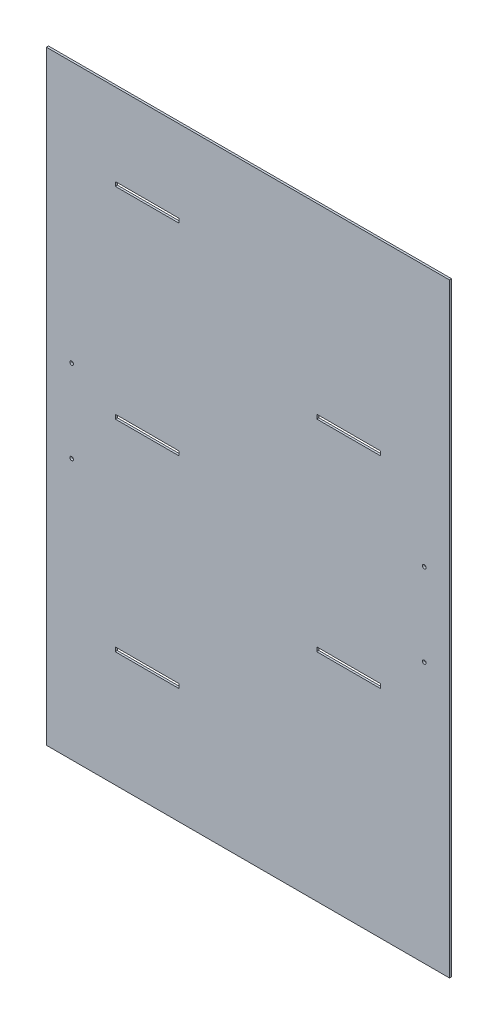
ISO-10303-21;
HEADER;
FILE_DESCRIPTION(('STEP AP214'),'2;1');
FILE_NAME('part.step','',(''),(''),'','','');
FILE_SCHEMA(('AUTOMOTIVE_DESIGN { 1 0 10303 214 1 1 1 1 }'));
ENDSEC;
DATA;
#1=APPLICATION_CONTEXT('core data for automotive mechanical design processes');
#2=APPLICATION_PROTOCOL_DEFINITION('international standard','automotive_design',2000,#1);
#3=PRODUCT_CONTEXT('',#1,'mechanical');
#4=PRODUCT('Part','Part','',(#3));
#5=PRODUCT_RELATED_PRODUCT_CATEGORY('part','',(#4));
#6=PRODUCT_DEFINITION_FORMATION('','',#4);
#7=PRODUCT_DEFINITION_CONTEXT('part definition',#1,'design');
#8=PRODUCT_DEFINITION('design','',#6,#7);
#9=PRODUCT_DEFINITION_SHAPE('','',#8);
#10=(LENGTH_UNIT() NAMED_UNIT(*) SI_UNIT(.MILLI.,.METRE.));
#11=(NAMED_UNIT(*) PLANE_ANGLE_UNIT() SI_UNIT($,.RADIAN.));
#12=(NAMED_UNIT(*) SI_UNIT($,.STERADIAN.) SOLID_ANGLE_UNIT());
#13=UNCERTAINTY_MEASURE_WITH_UNIT(LENGTH_MEASURE(1.E-05),#10,'distance_accuracy_value','');
#14=(GEOMETRIC_REPRESENTATION_CONTEXT(3) GLOBAL_UNCERTAINTY_ASSIGNED_CONTEXT((#13)) GLOBAL_UNIT_ASSIGNED_CONTEXT((#10,
#11,#12)) REPRESENTATION_CONTEXT('',''));
#15=CARTESIAN_POINT('',(0.,0.,0.));
#16=DIRECTION('',(0.,0.,1.));
#17=DIRECTION('',(1.,0.,0.));
#18=AXIS2_PLACEMENT_3D('',#15,#16,#17);
#19=CARTESIAN_POINT('',(0.,0.,1.5875));
#20=DIRECTION('',(0.,0.,-1.));
#21=DIRECTION('',(-1.,0.,0.));
#22=AXIS2_PLACEMENT_3D('',#19,#20,#21);
#23=PLANE('',#22);
#24=CARTESIAN_POINT('',(-266.7,62.5,1.5875));
#25=DIRECTION('',(0.,0.,1.));
#26=DIRECTION('',(1.,0.,0.));
#27=AXIS2_PLACEMENT_3D('',#24,#25,#26);
#28=CIRCLE('',#27,2.74999999999997);
#29=CARTESIAN_POINT('',(-263.95,62.5,1.5875));
#30=VERTEX_POINT('',#29);
#31=EDGE_CURVE('E761',#30,#30,#28,.T.);
#32=ORIENTED_EDGE('',*,*,#31,.F.);
#33=EDGE_LOOP('',(#32));
#34=FACE_BOUND('',#33,.T.);
#35=CARTESIAN_POINT('',(-266.7,-62.5,1.5875));
#36=DIRECTION('',(0.,0.,1.));
#37=DIRECTION('',(1.,0.,0.));
#38=AXIS2_PLACEMENT_3D('',#35,#36,#37);
#39=CIRCLE('',#38,2.74999999999997);
#40=CARTESIAN_POINT('',(-263.95,-62.5,1.5875));
#41=VERTEX_POINT('',#40);
#42=EDGE_CURVE('E765',#41,#41,#39,.T.);
#43=ORIENTED_EDGE('',*,*,#42,.F.);
#44=EDGE_LOOP('',(#43));
#45=FACE_BOUND('',#44,.T.);
#46=CARTESIAN_POINT('',(266.7,-62.5,1.5875));
#47=DIRECTION('',(0.,0.,1.));
#48=DIRECTION('',(1.,0.,0.));
#49=AXIS2_PLACEMENT_3D('',#46,#47,#48);
#50=CIRCLE('',#49,2.74999999999997);
#51=CARTESIAN_POINT('',(269.45,-62.5,1.5875));
#52=VERTEX_POINT('',#51);
#53=EDGE_CURVE('E783',#52,#52,#50,.T.);
#54=ORIENTED_EDGE('',*,*,#53,.F.);
#55=EDGE_LOOP('',(#54));
#56=FACE_BOUND('',#55,.T.);
#57=DIRECTION('',(0.,1.,0.));
#58=VECTOR('',#57,1.);
#59=CARTESIAN_POINT('',(-104.14,0.,1.5875));
#60=LINE('',#59,#58);
#61=CARTESIAN_POINT('',(-104.14,22.225,1.5875));
#62=VERTEX_POINT('',#61);
#63=CARTESIAN_POINT('',(-104.14,28.575,1.5875));
#64=VERTEX_POINT('',#63);
#65=EDGE_CURVE('E317',#62,#64,#60,.T.);
#66=ORIENTED_EDGE('',*,*,#65,.F.);
#67=DIRECTION('',(1.,0.,0.));
#68=VECTOR('',#67,1.);
#69=CARTESIAN_POINT('',(0.,22.225,1.5875));
#70=LINE('',#69,#68);
#71=CARTESIAN_POINT('',(-200.66,22.225,1.5875));
#72=VERTEX_POINT('',#71);
#73=EDGE_CURVE('E55',#72,#62,#70,.T.);
#74=ORIENTED_EDGE('',*,*,#73,.F.);
#75=DIRECTION('',(0.,1.,0.));
#76=VECTOR('',#75,1.);
#77=CARTESIAN_POINT('',(-200.66,0.,1.5875));
#78=LINE('',#77,#76);
#79=CARTESIAN_POINT('',(-200.66,28.575,1.5875));
#80=VERTEX_POINT('',#79);
#81=EDGE_CURVE('E308',#72,#80,#78,.T.);
#82=ORIENTED_EDGE('',*,*,#81,.T.);
#83=DIRECTION('',(1.,0.,0.));
#84=VECTOR('',#83,1.);
#85=CARTESIAN_POINT('',(0.,28.575,1.5875));
#86=LINE('',#85,#84);
#87=EDGE_CURVE('E312',#80,#64,#86,.T.);
#88=ORIENTED_EDGE('',*,*,#87,.T.);
#89=EDGE_LOOP('',(#66,#74,#82,#88));
#90=FACE_BOUND('',#89,.T.);
#91=DIRECTION('',(0.,1.,0.));
#92=VECTOR('',#91,1.);
#93=CARTESIAN_POINT('',(200.66,0.,1.5875));
#94=LINE('',#93,#92);
#95=CARTESIAN_POINT('',(200.66,-130.175,1.5875));
#96=VERTEX_POINT('',#95);
#97=CARTESIAN_POINT('',(200.66,-123.825,1.5875));
#98=VERTEX_POINT('',#97);
#99=EDGE_CURVE('E355',#96,#98,#94,.T.);
#100=ORIENTED_EDGE('',*,*,#99,.F.);
#101=DIRECTION('',(1.,0.,0.));
#102=VECTOR('',#101,1.);
#103=CARTESIAN_POINT('',(0.,-130.175,1.5875));
#104=LINE('',#103,#102);
#105=CARTESIAN_POINT('',(104.14,-130.175,1.5875));
#106=VERTEX_POINT('',#105);
#107=EDGE_CURVE('E63',#106,#96,#104,.T.);
#108=ORIENTED_EDGE('',*,*,#107,.F.);
#109=DIRECTION('',(0.,1.,0.));
#110=VECTOR('',#109,1.);
#111=CARTESIAN_POINT('',(104.14,0.,1.5875));
#112=LINE('',#111,#110);
#113=CARTESIAN_POINT('',(104.14,-123.825,1.5875));
#114=VERTEX_POINT('',#113);
#115=EDGE_CURVE('E346',#106,#114,#112,.T.);
#116=ORIENTED_EDGE('',*,*,#115,.T.);
#117=DIRECTION('',(1.,0.,0.));
#118=VECTOR('',#117,1.);
#119=CARTESIAN_POINT('',(0.,-123.825,1.5875));
#120=LINE('',#119,#118);
#121=EDGE_CURVE('E350',#114,#98,#120,.T.);
#122=ORIENTED_EDGE('',*,*,#121,.T.);
#123=EDGE_LOOP('',(#100,#108,#116,#122));
#124=FACE_BOUND('',#123,.T.);
#125=DIRECTION('',(0.,1.,0.));
#126=VECTOR('',#125,1.);
#127=CARTESIAN_POINT('',(-104.14,0.,1.5875));
#128=LINE('',#127,#126);
#129=CARTESIAN_POINT('',(-104.14,-282.575,1.5875));
#130=VERTEX_POINT('',#129);
#131=CARTESIAN_POINT('',(-104.14,-276.225,1.5875));
#132=VERTEX_POINT('',#131);
#133=EDGE_CURVE('E227',#130,#132,#128,.T.);
#134=ORIENTED_EDGE('',*,*,#133,.F.);
#135=DIRECTION('',(1.,0.,0.));
#136=VECTOR('',#135,1.);
#137=CARTESIAN_POINT('',(0.,-282.575,1.5875));
#138=LINE('',#137,#136);
#139=CARTESIAN_POINT('',(-200.66,-282.575,1.5875));
#140=VERTEX_POINT('',#139);
#141=EDGE_CURVE('E204',#140,#130,#138,.T.);
#142=ORIENTED_EDGE('',*,*,#141,.F.);
#143=DIRECTION('',(0.,1.,0.));
#144=VECTOR('',#143,1.);
#145=CARTESIAN_POINT('',(-200.66,0.,1.5875));
#146=LINE('',#145,#144);
#147=CARTESIAN_POINT('',(-200.66,-276.225,1.5875));
#148=VERTEX_POINT('',#147);
#149=EDGE_CURVE('E215',#140,#148,#146,.T.);
#150=ORIENTED_EDGE('',*,*,#149,.T.);
#151=DIRECTION('',(1.,0.,0.));
#152=VECTOR('',#151,1.);
#153=CARTESIAN_POINT('',(0.,-276.225,1.5875));
#154=LINE('',#153,#152);
#155=EDGE_CURVE('E222',#148,#132,#154,.T.);
#156=ORIENTED_EDGE('',*,*,#155,.T.);
#157=EDGE_LOOP('',(#134,#142,#150,#156));
#158=FACE_BOUND('',#157,.T.);
#159=DIRECTION('',(0.,1.,0.));
#160=VECTOR('',#159,1.);
#161=CARTESIAN_POINT('',(-104.14,327.025,1.5875));
#162=LINE('',#161,#160);
#163=CARTESIAN_POINT('',(-104.14,327.025,1.5875));
#164=VERTEX_POINT('',#163);
#165=CARTESIAN_POINT('',(-104.14,333.375,1.5875));
#166=VERTEX_POINT('',#165);
#167=EDGE_CURVE('E276',#164,#166,#162,.T.);
#168=ORIENTED_EDGE('',*,*,#167,.F.);
#169=DIRECTION('',(1.,0.,0.));
#170=VECTOR('',#169,1.);
#171=CARTESIAN_POINT('',(-200.66,327.025,1.5875));
#172=LINE('',#171,#170);
#173=CARTESIAN_POINT('',(-200.66,327.025,1.5875));
#174=VERTEX_POINT('',#173);
#175=EDGE_CURVE('E212',#174,#164,#172,.T.);
#176=ORIENTED_EDGE('',*,*,#175,.F.);
#177=DIRECTION('',(0.,1.,0.));
#178=VECTOR('',#177,1.);
#179=CARTESIAN_POINT('',(-200.66,327.025,1.5875));
#180=LINE('',#179,#178);
#181=CARTESIAN_POINT('',(-200.66,333.375,1.5875));
#182=VERTEX_POINT('',#181);
#183=EDGE_CURVE('E267',#174,#182,#180,.T.);
#184=ORIENTED_EDGE('',*,*,#183,.T.);
#185=DIRECTION('',(1.,0.,0.));
#186=VECTOR('',#185,1.);
#187=CARTESIAN_POINT('',(-200.66,333.375,1.5875));
#188=LINE('',#187,#186);
#189=EDGE_CURVE('E271',#182,#166,#188,.T.);
#190=ORIENTED_EDGE('',*,*,#189,.T.);
#191=EDGE_LOOP('',(#168,#176,#184,#190));
#192=FACE_BOUND('',#191,.T.);
#193=DIRECTION('',(0.,1.,0.));
#194=VECTOR('',#193,1.);
#195=CARTESIAN_POINT('',(200.66,0.,1.5875));
#196=LINE('',#195,#194);
#197=CARTESIAN_POINT('',(200.66,174.625,1.5875));
#198=VERTEX_POINT('',#197);
#199=CARTESIAN_POINT('',(200.66,180.975,1.5875));
#200=VERTEX_POINT('',#199);
#201=EDGE_CURVE('E393',#198,#200,#196,.T.);
#202=ORIENTED_EDGE('',*,*,#201,.F.);
#203=DIRECTION('',(1.,0.,0.));
#204=VECTOR('',#203,1.);
#205=CARTESIAN_POINT('',(0.,174.625,1.5875));
#206=LINE('',#205,#204);
#207=CARTESIAN_POINT('',(104.14,174.625,1.5875));
#208=VERTEX_POINT('',#207);
#209=EDGE_CURVE('E323',#208,#198,#206,.T.);
#210=ORIENTED_EDGE('',*,*,#209,.F.);
#211=DIRECTION('',(0.,1.,0.));
#212=VECTOR('',#211,1.);
#213=CARTESIAN_POINT('',(104.14,0.,1.5875));
#214=LINE('',#213,#212);
#215=CARTESIAN_POINT('',(104.14,180.975,1.5875));
#216=VERTEX_POINT('',#215);
#217=EDGE_CURVE('E379',#208,#216,#214,.T.);
#218=ORIENTED_EDGE('',*,*,#217,.T.);
#219=DIRECTION('',(1.,0.,0.));
#220=VECTOR('',#219,1.);
#221=CARTESIAN_POINT('',(0.,180.975,1.5875));
#222=LINE('',#221,#220);
#223=EDGE_CURVE('E397',#216,#200,#222,.T.);
#224=ORIENTED_EDGE('',*,*,#223,.T.);
#225=EDGE_LOOP('',(#202,#210,#218,#224));
#226=FACE_BOUND('',#225,.T.);
#227=DIRECTION('',(0.,1.,0.));
#228=VECTOR('',#227,1.);
#229=CARTESIAN_POINT('',(304.8,-457.2,1.5875));
#230=LINE('',#229,#228);
#231=CARTESIAN_POINT('',(304.8,-457.2,1.5875));
#232=VERTEX_POINT('',#231);
#233=CARTESIAN_POINT('',(304.8,457.2,1.5875));
#234=VERTEX_POINT('',#233);
#235=EDGE_CURVE('E417',#232,#234,#230,.T.);
#236=ORIENTED_EDGE('',*,*,#235,.T.);
#237=DIRECTION('',(-1.,0.,0.));
#238=VECTOR('',#237,1.);
#239=CARTESIAN_POINT('',(-304.8,457.2,1.5875));
#240=LINE('',#239,#238);
#241=CARTESIAN_POINT('',(-304.8,457.2,1.5875));
#242=VERTEX_POINT('',#241);
#243=EDGE_CURVE('E421',#234,#242,#240,.T.);
#244=ORIENTED_EDGE('',*,*,#243,.T.);
#245=DIRECTION('',(0.,-1.,0.));
#246=VECTOR('',#245,1.);
#247=CARTESIAN_POINT('',(-304.8,-457.2,1.5875));
#248=LINE('',#247,#246);
#249=CARTESIAN_POINT('',(-304.8,-457.2,1.5875));
#250=VERTEX_POINT('',#249);
#251=EDGE_CURVE('E425',#242,#250,#248,.T.);
#252=ORIENTED_EDGE('',*,*,#251,.T.);
#253=DIRECTION('',(1.,0.,0.));
#254=VECTOR('',#253,1.);
#255=CARTESIAN_POINT('',(-304.8,-457.2,1.5875));
#256=LINE('',#255,#254);
#257=EDGE_CURVE('E428',#250,#232,#256,.T.);
#258=ORIENTED_EDGE('',*,*,#257,.T.);
#259=EDGE_LOOP('',(#236,#244,#252,#258));
#260=FACE_BOUND('',#259,.T.);
#261=CARTESIAN_POINT('',(266.7,62.5,1.5875));
#262=DIRECTION('',(0.,0.,1.));
#263=DIRECTION('',(1.,0.,0.));
#264=AXIS2_PLACEMENT_3D('',#261,#262,#263);
#265=CIRCLE('',#264,2.74999999999997);
#266=CARTESIAN_POINT('',(269.45,62.5,1.5875));
#267=VERTEX_POINT('',#266);
#268=EDGE_CURVE('E775',#267,#267,#265,.T.);
#269=ORIENTED_EDGE('',*,*,#268,.F.);
#270=EDGE_LOOP('',(#269));
#271=FACE_BOUND('',#270,.T.);
#272=ADVANCED_FACE('F39',(#34,#45,#56,#90,#124,#158,#192,#226,#260,#271),#23,.F.);
#273=CARTESIAN_POINT('',(304.8,-457.2,1.5875));
#274=DIRECTION('',(-1.,0.,0.));
#275=DIRECTION('',(0.,0.,1.));
#276=AXIS2_PLACEMENT_3D('',#273,#274,#275);
#277=PLANE('',#276);
#278=DIRECTION('',(0.,1.,0.));
#279=VECTOR('',#278,1.);
#280=CARTESIAN_POINT('',(304.8,-457.2,-1.5875));
#281=LINE('',#280,#279);
#282=CARTESIAN_POINT('',(304.8,-457.2,-1.5875));
#283=VERTEX_POINT('',#282);
#284=CARTESIAN_POINT('',(304.8,457.2,-1.5875));
#285=VERTEX_POINT('',#284);
#286=EDGE_CURVE('E407',#283,#285,#281,.T.);
#287=ORIENTED_EDGE('',*,*,#286,.T.);
#288=DIRECTION('',(0.,0.,-1.));
#289=VECTOR('',#288,1.);
#290=CARTESIAN_POINT('',(304.8,457.2,1.5875));
#291=LINE('',#290,#289);
#292=EDGE_CURVE('E11',#234,#285,#291,.T.);
#293=ORIENTED_EDGE('',*,*,#292,.F.);
#294=ORIENTED_EDGE('',*,*,#235,.F.);
#295=DIRECTION('',(0.,0.,-1.));
#296=VECTOR('',#295,1.);
#297=CARTESIAN_POINT('',(304.8,-457.2,1.5875));
#298=LINE('',#297,#296);
#299=EDGE_CURVE('E431',#232,#283,#298,.T.);
#300=ORIENTED_EDGE('',*,*,#299,.T.);
#301=EDGE_LOOP('',(#287,#293,#294,#300));
#302=FACE_BOUND('',#301,.T.);
#303=ADVANCED_FACE('F41',(#302),#277,.F.);
#304=CARTESIAN_POINT('',(-304.8,457.2,1.5875));
#305=DIRECTION('',(0.,-1.,0.));
#306=DIRECTION('',(0.,0.,-1.));
#307=AXIS2_PLACEMENT_3D('',#304,#305,#306);
#308=PLANE('',#307);
#309=DIRECTION('',(-1.,0.,0.));
#310=VECTOR('',#309,1.);
#311=CARTESIAN_POINT('',(-304.8,457.2,-1.5875));
#312=LINE('',#311,#310);
#313=CARTESIAN_POINT('',(-304.8,457.2,-1.5875));
#314=VERTEX_POINT('',#313);
#315=EDGE_CURVE('E435',#285,#314,#312,.T.);
#316=ORIENTED_EDGE('',*,*,#315,.T.);
#317=DIRECTION('',(0.,0.,-1.));
#318=VECTOR('',#317,1.);
#319=CARTESIAN_POINT('',(-304.8,457.2,1.5875));
#320=LINE('',#319,#318);
#321=EDGE_CURVE('E48',#242,#314,#320,.T.);
#322=ORIENTED_EDGE('',*,*,#321,.F.);
#323=ORIENTED_EDGE('',*,*,#243,.F.);
#324=ORIENTED_EDGE('',*,*,#292,.T.);
#325=EDGE_LOOP('',(#316,#322,#323,#324));
#326=FACE_BOUND('',#325,.T.);
#327=ADVANCED_FACE('F471',(#326),#308,.F.);
#328=CARTESIAN_POINT('',(-304.8,-457.2,1.5875));
#329=DIRECTION('',(1.,0.,0.));
#330=DIRECTION('',(0.,0.,-1.));
#331=AXIS2_PLACEMENT_3D('',#328,#329,#330);
#332=PLANE('',#331);
#333=DIRECTION('',(0.,-1.,0.));
#334=VECTOR('',#333,1.);
#335=CARTESIAN_POINT('',(-304.8,-457.2,-1.5875));
#336=LINE('',#335,#334);
#337=CARTESIAN_POINT('',(-304.8,-457.2,-1.5875));
#338=VERTEX_POINT('',#337);
#339=EDGE_CURVE('E438',#314,#338,#336,.T.);
#340=ORIENTED_EDGE('',*,*,#339,.T.);
#341=DIRECTION('',(0.,0.,-1.));
#342=VECTOR('',#341,1.);
#343=CARTESIAN_POINT('',(-304.8,-457.2,1.5875));
#344=LINE('',#343,#342);
#345=EDGE_CURVE('E446',#250,#338,#344,.T.);
#346=ORIENTED_EDGE('',*,*,#345,.F.);
#347=ORIENTED_EDGE('',*,*,#251,.F.);
#348=ORIENTED_EDGE('',*,*,#321,.T.);
#349=EDGE_LOOP('',(#340,#346,#347,#348));
#350=FACE_BOUND('',#349,.T.);
#351=ADVANCED_FACE('F455',(#350),#332,.F.);
#352=CARTESIAN_POINT('',(-304.8,-457.2,1.5875));
#353=DIRECTION('',(0.,1.,0.));
#354=DIRECTION('',(0.,0.,1.));
#355=AXIS2_PLACEMENT_3D('',#352,#353,#354);
#356=PLANE('',#355);
#357=DIRECTION('',(1.,0.,0.));
#358=VECTOR('',#357,1.);
#359=CARTESIAN_POINT('',(-304.8,-457.2,-1.5875));
#360=LINE('',#359,#358);
#361=EDGE_CURVE('E422',#338,#283,#360,.T.);
#362=ORIENTED_EDGE('',*,*,#361,.T.);
#363=ORIENTED_EDGE('',*,*,#299,.F.);
#364=ORIENTED_EDGE('',*,*,#257,.F.);
#365=ORIENTED_EDGE('',*,*,#345,.T.);
#366=EDGE_LOOP('',(#362,#363,#364,#365));
#367=FACE_BOUND('',#366,.T.);
#368=ADVANCED_FACE('F464',(#367),#356,.F.);
#369=CARTESIAN_POINT('',(0.,0.,-1.5875));
#370=DIRECTION('',(0.,0.,-1.));
#371=DIRECTION('',(-1.,0.,0.));
#372=AXIS2_PLACEMENT_3D('',#369,#370,#371);
#373=PLANE('',#372);
#374=CARTESIAN_POINT('',(-266.7,62.5,-1.5875));
#375=DIRECTION('',(0.,0.,1.));
#376=DIRECTION('',(1.,0.,0.));
#377=AXIS2_PLACEMENT_3D('',#374,#375,#376);
#378=CIRCLE('',#377,2.74999999999997);
#379=CARTESIAN_POINT('',(-263.95,62.5,-1.5875));
#380=VERTEX_POINT('',#379);
#381=EDGE_CURVE('E759',#380,#380,#378,.T.);
#382=ORIENTED_EDGE('',*,*,#381,.T.);
#383=EDGE_LOOP('',(#382));
#384=FACE_BOUND('',#383,.T.);
#385=CARTESIAN_POINT('',(-266.7,-62.5,-1.5875));
#386=DIRECTION('',(0.,0.,1.));
#387=DIRECTION('',(1.,0.,0.));
#388=AXIS2_PLACEMENT_3D('',#385,#386,#387);
#389=CIRCLE('',#388,2.74999999999997);
#390=CARTESIAN_POINT('',(-263.95,-62.5,-1.5875));
#391=VERTEX_POINT('',#390);
#392=EDGE_CURVE('E771',#391,#391,#389,.T.);
#393=ORIENTED_EDGE('',*,*,#392,.T.);
#394=EDGE_LOOP('',(#393));
#395=FACE_BOUND('',#394,.T.);
#396=CARTESIAN_POINT('',(266.7,62.5,-1.5875));
#397=DIRECTION('',(0.,0.,1.));
#398=DIRECTION('',(1.,0.,0.));
#399=AXIS2_PLACEMENT_3D('',#396,#397,#398);
#400=CIRCLE('',#399,2.74999999999997);
#401=CARTESIAN_POINT('',(269.45,62.5,-1.5875));
#402=VERTEX_POINT('',#401);
#403=EDGE_CURVE('E779',#402,#402,#400,.T.);
#404=ORIENTED_EDGE('',*,*,#403,.T.);
#405=EDGE_LOOP('',(#404));
#406=FACE_BOUND('',#405,.T.);
#407=CARTESIAN_POINT('',(266.7,-62.5,-1.5875));
#408=DIRECTION('',(0.,0.,1.));
#409=DIRECTION('',(1.,0.,0.));
#410=AXIS2_PLACEMENT_3D('',#407,#408,#409);
#411=CIRCLE('',#410,2.74999999999997);
#412=CARTESIAN_POINT('',(269.45,-62.5,-1.5875));
#413=VERTEX_POINT('',#412);
#414=EDGE_CURVE('E266',#413,#413,#411,.T.);
#415=ORIENTED_EDGE('',*,*,#414,.T.);
#416=EDGE_LOOP('',(#415));
#417=FACE_BOUND('',#416,.T.);
#418=DIRECTION('',(1.,0.,0.));
#419=VECTOR('',#418,1.);
#420=CARTESIAN_POINT('',(0.,22.225,-1.5875));
#421=LINE('',#420,#419);
#422=CARTESIAN_POINT('',(-200.66,22.225,-1.5875));
#423=VERTEX_POINT('',#422);
#424=CARTESIAN_POINT('',(-104.14,22.225,-1.5875));
#425=VERTEX_POINT('',#424);
#426=EDGE_CURVE('E313',#423,#425,#421,.T.);
#427=ORIENTED_EDGE('',*,*,#426,.T.);
#428=DIRECTION('',(0.,1.,0.));
#429=VECTOR('',#428,1.);
#430=CARTESIAN_POINT('',(-104.14,0.,-1.5875));
#431=LINE('',#430,#429);
#432=CARTESIAN_POINT('',(-104.14,28.575,-1.5875));
#433=VERTEX_POINT('',#432);
#434=EDGE_CURVE('E330',#425,#433,#431,.T.);
#435=ORIENTED_EDGE('',*,*,#434,.T.);
#436=DIRECTION('',(1.,0.,0.));
#437=VECTOR('',#436,1.);
#438=CARTESIAN_POINT('',(0.,28.575,-1.5875));
#439=LINE('',#438,#437);
#440=CARTESIAN_POINT('',(-200.66,28.575,-1.5875));
#441=VERTEX_POINT('',#440);
#442=EDGE_CURVE('E326',#441,#433,#439,.T.);
#443=ORIENTED_EDGE('',*,*,#442,.F.);
#444=DIRECTION('',(0.,1.,0.));
#445=VECTOR('',#444,1.);
#446=CARTESIAN_POINT('',(-200.66,0.,-1.5875));
#447=LINE('',#446,#445);
#448=EDGE_CURVE('E298',#423,#441,#447,.T.);
#449=ORIENTED_EDGE('',*,*,#448,.F.);
#450=EDGE_LOOP('',(#427,#435,#443,#449));
#451=FACE_BOUND('',#450,.T.);
#452=DIRECTION('',(1.,0.,0.));
#453=VECTOR('',#452,1.);
#454=CARTESIAN_POINT('',(0.,-130.175,-1.5875));
#455=LINE('',#454,#453);
#456=CARTESIAN_POINT('',(104.14,-130.175,-1.5875));
#457=VERTEX_POINT('',#456);
#458=CARTESIAN_POINT('',(200.66,-130.175,-1.5875));
#459=VERTEX_POINT('',#458);
#460=EDGE_CURVE('E351',#457,#459,#455,.T.);
#461=ORIENTED_EDGE('',*,*,#460,.T.);
#462=DIRECTION('',(0.,1.,0.));
#463=VECTOR('',#462,1.);
#464=CARTESIAN_POINT('',(200.66,0.,-1.5875));
#465=LINE('',#464,#463);
#466=CARTESIAN_POINT('',(200.66,-123.825,-1.5875));
#467=VERTEX_POINT('',#466);
#468=EDGE_CURVE('E367',#459,#467,#465,.T.);
#469=ORIENTED_EDGE('',*,*,#468,.T.);
#470=DIRECTION('',(1.,0.,0.));
#471=VECTOR('',#470,1.);
#472=CARTESIAN_POINT('',(0.,-123.825,-1.5875));
#473=LINE('',#472,#471);
#474=CARTESIAN_POINT('',(104.14,-123.825,-1.5875));
#475=VERTEX_POINT('',#474);
#476=EDGE_CURVE('E363',#475,#467,#473,.T.);
#477=ORIENTED_EDGE('',*,*,#476,.F.);
#478=DIRECTION('',(0.,1.,0.));
#479=VECTOR('',#478,1.);
#480=CARTESIAN_POINT('',(104.14,0.,-1.5875));
#481=LINE('',#480,#479);
#482=EDGE_CURVE('E340',#457,#475,#481,.T.);
#483=ORIENTED_EDGE('',*,*,#482,.F.);
#484=EDGE_LOOP('',(#461,#469,#477,#483));
#485=FACE_BOUND('',#484,.T.);
#486=DIRECTION('',(1.,0.,0.));
#487=VECTOR('',#486,1.);
#488=CARTESIAN_POINT('',(0.,-282.575,-1.5875));
#489=LINE('',#488,#487);
#490=CARTESIAN_POINT('',(-200.66,-282.575,-1.5875));
#491=VERTEX_POINT('',#490);
#492=CARTESIAN_POINT('',(-104.14,-282.575,-1.5875));
#493=VERTEX_POINT('',#492);
#494=EDGE_CURVE('E207',#491,#493,#489,.T.);
#495=ORIENTED_EDGE('',*,*,#494,.T.);
#496=DIRECTION('',(0.,1.,0.));
#497=VECTOR('',#496,1.);
#498=CARTESIAN_POINT('',(-104.14,0.,-1.5875));
#499=LINE('',#498,#497);
#500=CARTESIAN_POINT('',(-104.14,-276.225,-1.5875));
#501=VERTEX_POINT('',#500);
#502=EDGE_CURVE('E246',#493,#501,#499,.T.);
#503=ORIENTED_EDGE('',*,*,#502,.T.);
#504=DIRECTION('',(1.,0.,0.));
#505=VECTOR('',#504,1.);
#506=CARTESIAN_POINT('',(0.,-276.225,-1.5875));
#507=LINE('',#506,#505);
#508=CARTESIAN_POINT('',(-200.66,-276.225,-1.5875));
#509=VERTEX_POINT('',#508);
#510=EDGE_CURVE('E241',#509,#501,#507,.T.);
#511=ORIENTED_EDGE('',*,*,#510,.F.);
#512=DIRECTION('',(0.,1.,0.));
#513=VECTOR('',#512,1.);
#514=CARTESIAN_POINT('',(-200.66,0.,-1.5875));
#515=LINE('',#514,#513);
#516=EDGE_CURVE('E238',#491,#509,#515,.T.);
#517=ORIENTED_EDGE('',*,*,#516,.F.);
#518=EDGE_LOOP('',(#495,#503,#511,#517));
#519=FACE_BOUND('',#518,.T.);
#520=DIRECTION('',(1.,0.,0.));
#521=VECTOR('',#520,1.);
#522=CARTESIAN_POINT('',(-200.66,327.025,-1.5875));
#523=LINE('',#522,#521);
#524=CARTESIAN_POINT('',(-200.66,327.025,-1.5875));
#525=VERTEX_POINT('',#524);
#526=CARTESIAN_POINT('',(-104.14,327.025,-1.5875));
#527=VERTEX_POINT('',#526);
#528=EDGE_CURVE('E272',#525,#527,#523,.T.);
#529=ORIENTED_EDGE('',*,*,#528,.T.);
#530=DIRECTION('',(0.,1.,0.));
#531=VECTOR('',#530,1.);
#532=CARTESIAN_POINT('',(-104.14,327.025,-1.5875));
#533=LINE('',#532,#531);
#534=CARTESIAN_POINT('',(-104.14,333.375,-1.5875));
#535=VERTEX_POINT('',#534);
#536=EDGE_CURVE('E288',#527,#535,#533,.T.);
#537=ORIENTED_EDGE('',*,*,#536,.T.);
#538=DIRECTION('',(1.,0.,0.));
#539=VECTOR('',#538,1.);
#540=CARTESIAN_POINT('',(-200.66,333.375,-1.5875));
#541=LINE('',#540,#539);
#542=CARTESIAN_POINT('',(-200.66,333.375,-1.5875));
#543=VERTEX_POINT('',#542);
#544=EDGE_CURVE('E284',#543,#535,#541,.T.);
#545=ORIENTED_EDGE('',*,*,#544,.F.);
#546=DIRECTION('',(0.,1.,0.));
#547=VECTOR('',#546,1.);
#548=CARTESIAN_POINT('',(-200.66,327.025,-1.5875));
#549=LINE('',#548,#547);
#550=EDGE_CURVE('E256',#525,#543,#549,.T.);
#551=ORIENTED_EDGE('',*,*,#550,.F.);
#552=EDGE_LOOP('',(#529,#537,#545,#551));
#553=FACE_BOUND('',#552,.T.);
#554=DIRECTION('',(1.,0.,0.));
#555=VECTOR('',#554,1.);
#556=CARTESIAN_POINT('',(0.,174.625,-1.5875));
#557=LINE('',#556,#555);
#558=CARTESIAN_POINT('',(104.14,174.625,-1.5875));
#559=VERTEX_POINT('',#558);
#560=CARTESIAN_POINT('',(200.66,174.625,-1.5875));
#561=VERTEX_POINT('',#560);
#562=EDGE_CURVE('E374',#559,#561,#557,.T.);
#563=ORIENTED_EDGE('',*,*,#562,.T.);
#564=DIRECTION('',(0.,1.,0.));
#565=VECTOR('',#564,1.);
#566=CARTESIAN_POINT('',(200.66,0.,-1.5875));
#567=LINE('',#566,#565);
#568=CARTESIAN_POINT('',(200.66,180.975,-1.5875));
#569=VERTEX_POINT('',#568);
#570=EDGE_CURVE('E378',#561,#569,#567,.T.);
#571=ORIENTED_EDGE('',*,*,#570,.T.);
#572=DIRECTION('',(1.,0.,0.));
#573=VECTOR('',#572,1.);
#574=CARTESIAN_POINT('',(0.,180.975,-1.5875));
#575=LINE('',#574,#573);
#576=CARTESIAN_POINT('',(104.14,180.975,-1.5875));
#577=VERTEX_POINT('',#576);
#578=EDGE_CURVE('E383',#577,#569,#575,.T.);
#579=ORIENTED_EDGE('',*,*,#578,.F.);
#580=DIRECTION('',(0.,1.,0.));
#581=VECTOR('',#580,1.);
#582=CARTESIAN_POINT('',(104.14,0.,-1.5875));
#583=LINE('',#582,#581);
#584=EDGE_CURVE('E387',#559,#577,#583,.T.);
#585=ORIENTED_EDGE('',*,*,#584,.F.);
#586=EDGE_LOOP('',(#563,#571,#579,#585));
#587=FACE_BOUND('',#586,.T.);
#588=ORIENTED_EDGE('',*,*,#286,.F.);
#589=ORIENTED_EDGE('',*,*,#361,.F.);
#590=ORIENTED_EDGE('',*,*,#339,.F.);
#591=ORIENTED_EDGE('',*,*,#315,.F.);
#592=EDGE_LOOP('',(#588,#589,#590,#591));
#593=FACE_BOUND('',#592,.T.);
#594=ADVANCED_FACE('F461',(#384,#395,#406,#417,#451,#485,#519,#553,#587,#593),#373,.T.);
#595=CARTESIAN_POINT('',(0.,174.625,-1.5875));
#596=DIRECTION('',(0.,-1.,0.));
#597=DIRECTION('',(0.,0.,-1.));
#598=AXIS2_PLACEMENT_3D('',#595,#596,#597);
#599=PLANE('',#598);
#600=ORIENTED_EDGE('',*,*,#209,.T.);
#601=DIRECTION('',(0.,0.,1.));
#602=VECTOR('',#601,1.);
#603=CARTESIAN_POINT('',(200.66,174.625,-1.5875));
#604=LINE('',#603,#602);
#605=EDGE_CURVE('E390',#561,#198,#604,.T.);
#606=ORIENTED_EDGE('',*,*,#605,.F.);
#607=ORIENTED_EDGE('',*,*,#562,.F.);
#608=DIRECTION('',(0.,0.,1.));
#609=VECTOR('',#608,1.);
#610=CARTESIAN_POINT('',(104.14,174.625,-1.5875));
#611=LINE('',#610,#609);
#612=EDGE_CURVE('E404',#559,#208,#611,.T.);
#613=ORIENTED_EDGE('',*,*,#612,.T.);
#614=EDGE_LOOP('',(#600,#606,#607,#613));
#615=FACE_BOUND('',#614,.T.);
#616=ADVANCED_FACE('F487',(#615),#599,.F.);
#617=CARTESIAN_POINT('',(104.14,0.,-1.5875));
#618=DIRECTION('',(1.,0.,0.));
#619=DIRECTION('',(0.,0.,-1.));
#620=AXIS2_PLACEMENT_3D('',#617,#618,#619);
#621=PLANE('',#620);
#622=ORIENTED_EDGE('',*,*,#217,.F.);
#623=ORIENTED_EDGE('',*,*,#612,.F.);
#624=ORIENTED_EDGE('',*,*,#584,.T.);
#625=DIRECTION('',(0.,0.,1.));
#626=VECTOR('',#625,1.);
#627=CARTESIAN_POINT('',(104.14,180.975,-1.5875));
#628=LINE('',#627,#626);
#629=EDGE_CURVE('E408',#577,#216,#628,.T.);
#630=ORIENTED_EDGE('',*,*,#629,.T.);
#631=EDGE_LOOP('',(#622,#623,#624,#630));
#632=FACE_BOUND('',#631,.T.);
#633=ADVANCED_FACE('F508',(#632),#621,.T.);
#634=CARTESIAN_POINT('',(0.,180.975,-1.5875));
#635=DIRECTION('',(0.,-1.,0.));
#636=DIRECTION('',(1.,0.,0.));
#637=AXIS2_PLACEMENT_3D('',#634,#635,#636);
#638=PLANE('',#637);
#639=ORIENTED_EDGE('',*,*,#223,.F.);
#640=ORIENTED_EDGE('',*,*,#629,.F.);
#641=ORIENTED_EDGE('',*,*,#578,.T.);
#642=DIRECTION('',(0.,0.,1.));
#643=VECTOR('',#642,1.);
#644=CARTESIAN_POINT('',(200.66,180.975,-1.5875));
#645=LINE('',#644,#643);
#646=EDGE_CURVE('E411',#569,#200,#645,.T.);
#647=ORIENTED_EDGE('',*,*,#646,.T.);
#648=EDGE_LOOP('',(#639,#640,#641,#647));
#649=FACE_BOUND('',#648,.T.);
#650=ADVANCED_FACE('F515',(#649),#638,.T.);
#651=CARTESIAN_POINT('',(200.66,0.,-1.5875));
#652=DIRECTION('',(1.,0.,0.));
#653=DIRECTION('',(0.,0.,-1.));
#654=AXIS2_PLACEMENT_3D('',#651,#652,#653);
#655=PLANE('',#654);
#656=ORIENTED_EDGE('',*,*,#201,.T.);
#657=ORIENTED_EDGE('',*,*,#646,.F.);
#658=ORIENTED_EDGE('',*,*,#570,.F.);
#659=ORIENTED_EDGE('',*,*,#605,.T.);
#660=EDGE_LOOP('',(#656,#657,#658,#659));
#661=FACE_BOUND('',#660,.T.);
#662=ADVANCED_FACE('F523',(#661),#655,.F.);
#663=CARTESIAN_POINT('',(-200.66,327.025,-1.5875));
#664=DIRECTION('',(0.,-1.,0.));
#665=DIRECTION('',(0.,0.,-1.));
#666=AXIS2_PLACEMENT_3D('',#663,#664,#665);
#667=PLANE('',#666);
#668=ORIENTED_EDGE('',*,*,#175,.T.);
#669=DIRECTION('',(0.,0.,1.));
#670=VECTOR('',#669,1.);
#671=CARTESIAN_POINT('',(-104.14,327.025,-1.5875));
#672=LINE('',#671,#670);
#673=EDGE_CURVE('E252',#527,#164,#672,.T.);
#674=ORIENTED_EDGE('',*,*,#673,.F.);
#675=ORIENTED_EDGE('',*,*,#528,.F.);
#676=DIRECTION('',(0.,0.,1.));
#677=VECTOR('',#676,1.);
#678=CARTESIAN_POINT('',(-200.66,327.025,-1.5875));
#679=LINE('',#678,#677);
#680=EDGE_CURVE('E263',#525,#174,#679,.T.);
#681=ORIENTED_EDGE('',*,*,#680,.T.);
#682=EDGE_LOOP('',(#668,#674,#675,#681));
#683=FACE_BOUND('',#682,.T.);
#684=ADVANCED_FACE('F531',(#683),#667,.F.);
#685=CARTESIAN_POINT('',(-200.66,327.025,-1.5875));
#686=DIRECTION('',(1.,0.,0.));
#687=DIRECTION('',(0.,0.,-1.));
#688=AXIS2_PLACEMENT_3D('',#685,#686,#687);
#689=PLANE('',#688);
#690=ORIENTED_EDGE('',*,*,#183,.F.);
#691=ORIENTED_EDGE('',*,*,#680,.F.);
#692=ORIENTED_EDGE('',*,*,#550,.T.);
#693=DIRECTION('',(0.,0.,1.));
#694=VECTOR('',#693,1.);
#695=CARTESIAN_POINT('',(-200.66,333.375,-1.5875));
#696=LINE('',#695,#694);
#697=EDGE_CURVE('E260',#543,#182,#696,.T.);
#698=ORIENTED_EDGE('',*,*,#697,.T.);
#699=EDGE_LOOP('',(#690,#691,#692,#698));
#700=FACE_BOUND('',#699,.T.);
#701=ADVANCED_FACE('F538',(#700),#689,.T.);
#702=CARTESIAN_POINT('',(-200.66,333.375,-1.5875));
#703=DIRECTION('',(0.,-1.,0.));
#704=DIRECTION('',(0.,0.,-1.));
#705=AXIS2_PLACEMENT_3D('',#702,#703,#704);
#706=PLANE('',#705);
#707=ORIENTED_EDGE('',*,*,#189,.F.);
#708=ORIENTED_EDGE('',*,*,#697,.F.);
#709=ORIENTED_EDGE('',*,*,#544,.T.);
#710=DIRECTION('',(0.,0.,1.));
#711=VECTOR('',#710,1.);
#712=CARTESIAN_POINT('',(-104.14,333.375,-1.5875));
#713=LINE('',#712,#711);
#714=EDGE_CURVE('E257',#535,#166,#713,.T.);
#715=ORIENTED_EDGE('',*,*,#714,.T.);
#716=EDGE_LOOP('',(#707,#708,#709,#715));
#717=FACE_BOUND('',#716,.T.);
#718=ADVANCED_FACE('F546',(#717),#706,.T.);
#719=CARTESIAN_POINT('',(-104.14,327.025,-1.5875));
#720=DIRECTION('',(1.,0.,0.));
#721=DIRECTION('',(0.,0.,-1.));
#722=AXIS2_PLACEMENT_3D('',#719,#720,#721);
#723=PLANE('',#722);
#724=ORIENTED_EDGE('',*,*,#167,.T.);
#725=ORIENTED_EDGE('',*,*,#714,.F.);
#726=ORIENTED_EDGE('',*,*,#536,.F.);
#727=ORIENTED_EDGE('',*,*,#673,.T.);
#728=EDGE_LOOP('',(#724,#725,#726,#727));
#729=FACE_BOUND('',#728,.T.);
#730=ADVANCED_FACE('F554',(#729),#723,.F.);
#731=CARTESIAN_POINT('',(0.,-282.575,-1.5875));
#732=DIRECTION('',(0.,-1.,0.));
#733=DIRECTION('',(0.,0.,-1.));
#734=AXIS2_PLACEMENT_3D('',#731,#732,#733);
#735=PLANE('',#734);
#736=ORIENTED_EDGE('',*,*,#141,.T.);
#737=DIRECTION('',(0.,0.,1.));
#738=VECTOR('',#737,1.);
#739=CARTESIAN_POINT('',(-104.14,-282.575,-1.5875));
#740=LINE('',#739,#738);
#741=EDGE_CURVE('E242',#493,#130,#740,.T.);
#742=ORIENTED_EDGE('',*,*,#741,.F.);
#743=ORIENTED_EDGE('',*,*,#494,.F.);
#744=DIRECTION('',(0.,0.,1.));
#745=VECTOR('',#744,1.);
#746=CARTESIAN_POINT('',(-200.66,-282.575,-1.5875));
#747=LINE('',#746,#745);
#748=EDGE_CURVE('E200',#491,#140,#747,.T.);
#749=ORIENTED_EDGE('',*,*,#748,.T.);
#750=EDGE_LOOP('',(#736,#742,#743,#749));
#751=FACE_BOUND('',#750,.T.);
#752=ADVANCED_FACE('F202',(#751),#735,.F.);
#753=CARTESIAN_POINT('',(-200.66,0.,-1.5875));
#754=DIRECTION('',(1.,0.,0.));
#755=DIRECTION('',(0.,0.,-1.));
#756=AXIS2_PLACEMENT_3D('',#753,#754,#755);
#757=PLANE('',#756);
#758=ORIENTED_EDGE('',*,*,#149,.F.);
#759=ORIENTED_EDGE('',*,*,#748,.F.);
#760=ORIENTED_EDGE('',*,*,#516,.T.);
#761=DIRECTION('',(0.,0.,1.));
#762=VECTOR('',#761,1.);
#763=CARTESIAN_POINT('',(-200.66,-276.225,-1.5875));
#764=LINE('',#763,#762);
#765=EDGE_CURVE('E211',#509,#148,#764,.T.);
#766=ORIENTED_EDGE('',*,*,#765,.T.);
#767=EDGE_LOOP('',(#758,#759,#760,#766));
#768=FACE_BOUND('',#767,.T.);
#769=ADVANCED_FACE('F216',(#768),#757,.T.);
#770=CARTESIAN_POINT('',(0.,-276.225,-1.5875));
#771=DIRECTION('',(0.,-1.,0.));
#772=DIRECTION('',(0.,0.,-1.));
#773=AXIS2_PLACEMENT_3D('',#770,#771,#772);
#774=PLANE('',#773);
#775=ORIENTED_EDGE('',*,*,#155,.F.);
#776=ORIENTED_EDGE('',*,*,#765,.F.);
#777=ORIENTED_EDGE('',*,*,#510,.T.);
#778=DIRECTION('',(0.,0.,1.));
#779=VECTOR('',#778,1.);
#780=CARTESIAN_POINT('',(-104.14,-276.225,-1.5875));
#781=LINE('',#780,#779);
#782=EDGE_CURVE('E792',#501,#132,#781,.T.);
#783=ORIENTED_EDGE('',*,*,#782,.T.);
#784=EDGE_LOOP('',(#775,#776,#777,#783));
#785=FACE_BOUND('',#784,.T.);
#786=ADVANCED_FACE('F575',(#785),#774,.T.);
#787=CARTESIAN_POINT('',(-104.14,0.,-1.5875));
#788=DIRECTION('',(1.,0.,0.));
#789=DIRECTION('',(0.,0.,-1.));
#790=AXIS2_PLACEMENT_3D('',#787,#788,#789);
#791=PLANE('',#790);
#792=ORIENTED_EDGE('',*,*,#133,.T.);
#793=ORIENTED_EDGE('',*,*,#782,.F.);
#794=ORIENTED_EDGE('',*,*,#502,.F.);
#795=ORIENTED_EDGE('',*,*,#741,.T.);
#796=EDGE_LOOP('',(#792,#793,#794,#795));
#797=FACE_BOUND('',#796,.T.);
#798=ADVANCED_FACE('F582',(#797),#791,.F.);
#799=CARTESIAN_POINT('',(0.,-130.175,-1.5875));
#800=DIRECTION('',(0.,-1.,0.));
#801=DIRECTION('',(0.,0.,-1.));
#802=AXIS2_PLACEMENT_3D('',#799,#800,#801);
#803=PLANE('',#802);
#804=ORIENTED_EDGE('',*,*,#107,.T.);
#805=DIRECTION('',(0.,0.,1.));
#806=VECTOR('',#805,1.);
#807=CARTESIAN_POINT('',(200.66,-130.175,-1.5875));
#808=LINE('',#807,#806);
#809=EDGE_CURVE('E337',#459,#96,#808,.T.);
#810=ORIENTED_EDGE('',*,*,#809,.F.);
#811=ORIENTED_EDGE('',*,*,#460,.F.);
#812=DIRECTION('',(0.,0.,1.));
#813=VECTOR('',#812,1.);
#814=CARTESIAN_POINT('',(104.14,-130.175,-1.5875));
#815=LINE('',#814,#813);
#816=EDGE_CURVE('E229',#457,#106,#815,.T.);
#817=ORIENTED_EDGE('',*,*,#816,.T.);
#818=EDGE_LOOP('',(#804,#810,#811,#817));
#819=FACE_BOUND('',#818,.T.);
#820=ADVANCED_FACE('F590',(#819),#803,.F.);
#821=CARTESIAN_POINT('',(104.14,0.,-1.5875));
#822=DIRECTION('',(1.,0.,0.));
#823=DIRECTION('',(0.,0.,-1.));
#824=AXIS2_PLACEMENT_3D('',#821,#822,#823);
#825=PLANE('',#824);
#826=ORIENTED_EDGE('',*,*,#115,.F.);
#827=ORIENTED_EDGE('',*,*,#816,.F.);
#828=ORIENTED_EDGE('',*,*,#482,.T.);
#829=DIRECTION('',(0.,0.,1.));
#830=VECTOR('',#829,1.);
#831=CARTESIAN_POINT('',(104.14,-123.825,-1.5875));
#832=LINE('',#831,#830);
#833=EDGE_CURVE('E233',#475,#114,#832,.T.);
#834=ORIENTED_EDGE('',*,*,#833,.T.);
#835=EDGE_LOOP('',(#826,#827,#828,#834));
#836=FACE_BOUND('',#835,.T.);
#837=ADVANCED_FACE('F598',(#836),#825,.T.);
#838=CARTESIAN_POINT('',(0.,-123.825,-1.5875));
#839=DIRECTION('',(0.,-1.,0.));
#840=DIRECTION('',(0.,0.,-1.));
#841=AXIS2_PLACEMENT_3D('',#838,#839,#840);
#842=PLANE('',#841);
#843=ORIENTED_EDGE('',*,*,#121,.F.);
#844=ORIENTED_EDGE('',*,*,#833,.F.);
#845=ORIENTED_EDGE('',*,*,#476,.T.);
#846=DIRECTION('',(0.,0.,1.));
#847=VECTOR('',#846,1.);
#848=CARTESIAN_POINT('',(200.66,-123.825,-1.5875));
#849=LINE('',#848,#847);
#850=EDGE_CURVE('E341',#467,#98,#849,.T.);
#851=ORIENTED_EDGE('',*,*,#850,.T.);
#852=EDGE_LOOP('',(#843,#844,#845,#851));
#853=FACE_BOUND('',#852,.T.);
#854=ADVANCED_FACE('F605',(#853),#842,.T.);
#855=CARTESIAN_POINT('',(200.66,0.,-1.5875));
#856=DIRECTION('',(1.,0.,0.));
#857=DIRECTION('',(0.,0.,-1.));
#858=AXIS2_PLACEMENT_3D('',#855,#856,#857);
#859=PLANE('',#858);
#860=ORIENTED_EDGE('',*,*,#99,.T.);
#861=ORIENTED_EDGE('',*,*,#850,.F.);
#862=ORIENTED_EDGE('',*,*,#468,.F.);
#863=ORIENTED_EDGE('',*,*,#809,.T.);
#864=EDGE_LOOP('',(#860,#861,#862,#863));
#865=FACE_BOUND('',#864,.T.);
#866=ADVANCED_FACE('F613',(#865),#859,.F.);
#867=CARTESIAN_POINT('',(0.,22.225,-1.5875));
#868=DIRECTION('',(0.,-1.,0.));
#869=DIRECTION('',(0.,0.,-1.));
#870=AXIS2_PLACEMENT_3D('',#867,#868,#869);
#871=PLANE('',#870);
#872=ORIENTED_EDGE('',*,*,#73,.T.);
#873=DIRECTION('',(0.,0.,1.));
#874=VECTOR('',#873,1.);
#875=CARTESIAN_POINT('',(-104.14,22.225,-1.5875));
#876=LINE('',#875,#874);
#877=EDGE_CURVE('E295',#425,#62,#876,.T.);
#878=ORIENTED_EDGE('',*,*,#877,.F.);
#879=ORIENTED_EDGE('',*,*,#426,.F.);
#880=DIRECTION('',(0.,0.,1.));
#881=VECTOR('',#880,1.);
#882=CARTESIAN_POINT('',(-200.66,22.225,-1.5875));
#883=LINE('',#882,#881);
#884=EDGE_CURVE('E305',#423,#72,#883,.T.);
#885=ORIENTED_EDGE('',*,*,#884,.T.);
#886=EDGE_LOOP('',(#872,#878,#879,#885));
#887=FACE_BOUND('',#886,.T.);
#888=ADVANCED_FACE('F621',(#887),#871,.F.);
#889=CARTESIAN_POINT('',(-200.66,0.,-1.5875));
#890=DIRECTION('',(1.,0.,0.));
#891=DIRECTION('',(0.,0.,-1.));
#892=AXIS2_PLACEMENT_3D('',#889,#890,#891);
#893=PLANE('',#892);
#894=ORIENTED_EDGE('',*,*,#81,.F.);
#895=ORIENTED_EDGE('',*,*,#884,.F.);
#896=ORIENTED_EDGE('',*,*,#448,.T.);
#897=DIRECTION('',(0.,0.,1.));
#898=VECTOR('',#897,1.);
#899=CARTESIAN_POINT('',(-200.66,28.575,-1.5875));
#900=LINE('',#899,#898);
#901=EDGE_CURVE('E302',#441,#80,#900,.T.);
#902=ORIENTED_EDGE('',*,*,#901,.T.);
#903=EDGE_LOOP('',(#894,#895,#896,#902));
#904=FACE_BOUND('',#903,.T.);
#905=ADVANCED_FACE('F629',(#904),#893,.T.);
#906=CARTESIAN_POINT('',(0.,28.575,-1.5875));
#907=DIRECTION('',(0.,-1.,0.));
#908=DIRECTION('',(0.,0.,-1.));
#909=AXIS2_PLACEMENT_3D('',#906,#907,#908);
#910=PLANE('',#909);
#911=ORIENTED_EDGE('',*,*,#87,.F.);
#912=ORIENTED_EDGE('',*,*,#901,.F.);
#913=ORIENTED_EDGE('',*,*,#442,.T.);
#914=DIRECTION('',(0.,0.,1.));
#915=VECTOR('',#914,1.);
#916=CARTESIAN_POINT('',(-104.14,28.575,-1.5875));
#917=LINE('',#916,#915);
#918=EDGE_CURVE('E299',#433,#64,#917,.T.);
#919=ORIENTED_EDGE('',*,*,#918,.T.);
#920=EDGE_LOOP('',(#911,#912,#913,#919));
#921=FACE_BOUND('',#920,.T.);
#922=ADVANCED_FACE('F636',(#921),#910,.T.);
#923=CARTESIAN_POINT('',(-104.14,0.,-1.5875));
#924=DIRECTION('',(1.,0.,0.));
#925=DIRECTION('',(0.,0.,-1.));
#926=AXIS2_PLACEMENT_3D('',#923,#924,#925);
#927=PLANE('',#926);
#928=ORIENTED_EDGE('',*,*,#65,.T.);
#929=ORIENTED_EDGE('',*,*,#918,.F.);
#930=ORIENTED_EDGE('',*,*,#434,.F.);
#931=ORIENTED_EDGE('',*,*,#877,.T.);
#932=EDGE_LOOP('',(#928,#929,#930,#931));
#933=FACE_BOUND('',#932,.T.);
#934=ADVANCED_FACE('F644',(#933),#927,.F.);
#935=CARTESIAN_POINT('',(266.7,-62.5,1.5875));
#936=DIRECTION('',(0.,0.,1.));
#937=DIRECTION('',(1.,0.,0.));
#938=AXIS2_PLACEMENT_3D('',#935,#936,#937);
#939=CYLINDRICAL_SURFACE('',#938,2.74999999999997);
#940=ORIENTED_EDGE('',*,*,#414,.F.);
#941=EDGE_LOOP('',(#940));
#942=FACE_BOUND('',#941,.T.);
#943=ORIENTED_EDGE('',*,*,#53,.T.);
#944=EDGE_LOOP('',(#943));
#945=FACE_BOUND('',#944,.T.);
#946=ADVANCED_FACE('F652',(#942,#945),#939,.F.);
#947=CARTESIAN_POINT('',(266.7,62.5,1.5875));
#948=DIRECTION('',(0.,0.,1.));
#949=DIRECTION('',(1.,0.,0.));
#950=AXIS2_PLACEMENT_3D('',#947,#948,#949);
#951=CYLINDRICAL_SURFACE('',#950,2.74999999999997);
#952=ORIENTED_EDGE('',*,*,#403,.F.);
#953=EDGE_LOOP('',(#952));
#954=FACE_BOUND('',#953,.T.);
#955=ORIENTED_EDGE('',*,*,#268,.T.);
#956=EDGE_LOOP('',(#955));
#957=FACE_BOUND('',#956,.T.);
#958=ADVANCED_FACE('F659',(#954,#957),#951,.F.);
#959=CARTESIAN_POINT('',(-266.7,-62.5,1.5875));
#960=DIRECTION('',(0.,0.,1.));
#961=DIRECTION('',(1.,0.,0.));
#962=AXIS2_PLACEMENT_3D('',#959,#960,#961);
#963=CYLINDRICAL_SURFACE('',#962,2.74999999999997);
#964=ORIENTED_EDGE('',*,*,#392,.F.);
#965=EDGE_LOOP('',(#964));
#966=FACE_BOUND('',#965,.T.);
#967=ORIENTED_EDGE('',*,*,#42,.T.);
#968=EDGE_LOOP('',(#967));
#969=FACE_BOUND('',#968,.T.);
#970=ADVANCED_FACE('F667',(#966,#969),#963,.F.);
#971=CARTESIAN_POINT('',(-266.7,62.5,1.5875));
#972=DIRECTION('',(0.,0.,1.));
#973=DIRECTION('',(1.,0.,0.));
#974=AXIS2_PLACEMENT_3D('',#971,#972,#973);
#975=CYLINDRICAL_SURFACE('',#974,2.74999999999997);
#976=ORIENTED_EDGE('',*,*,#381,.F.);
#977=EDGE_LOOP('',(#976));
#978=FACE_BOUND('',#977,.T.);
#979=ORIENTED_EDGE('',*,*,#31,.T.);
#980=EDGE_LOOP('',(#979));
#981=FACE_BOUND('',#980,.T.);
#982=ADVANCED_FACE('F675',(#978,#981),#975,.F.);
#983=CLOSED_SHELL('',(#272,#303,#327,#351,#368,#594,#616,#633,#650,#662,#684,#701,#718,#730,
#752,#769,#786,#798,#820,#837,#854,#866,#888,#905,#922,#934,#946,#958,#970,#982));
#984=MANIFOLD_SOLID_BREP('B2',#983);
#985=ADVANCED_BREP_SHAPE_REPRESENTATION('',(#18,#984),#14);
#986=SHAPE_DEFINITION_REPRESENTATION(#9,#985);
ENDSEC;
END-ISO-10303-21;
